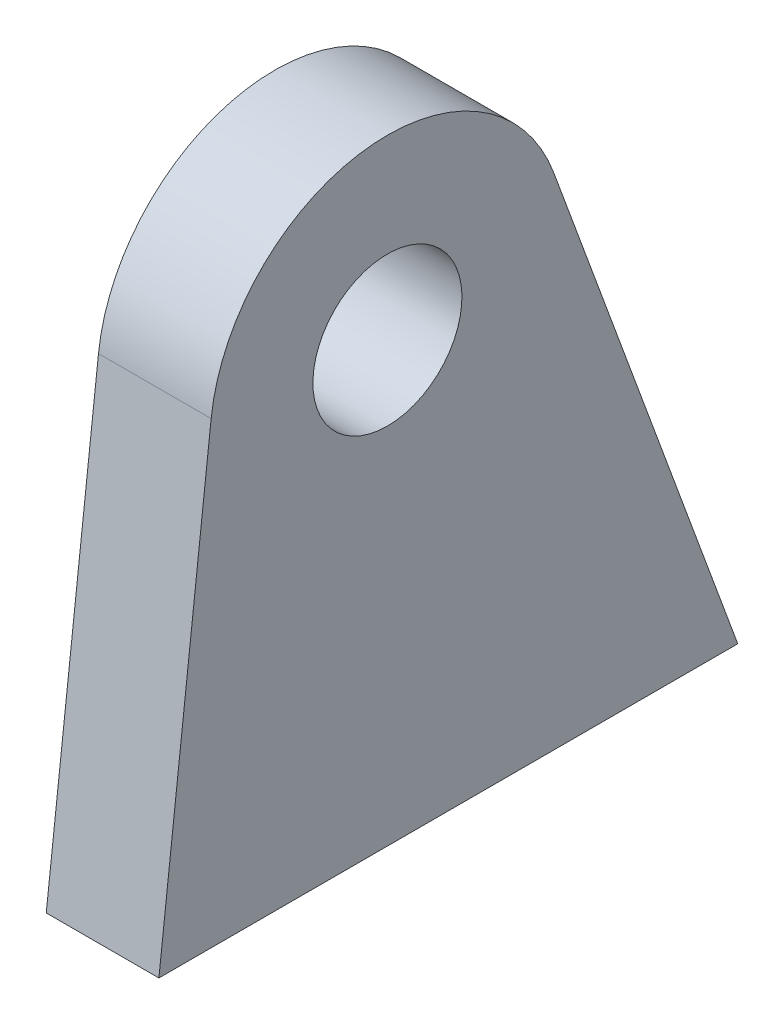
ISO-10303-21;
HEADER;
FILE_DESCRIPTION(('STEP AP214'),'2;1');
FILE_NAME('part.step','',(''),(''),'','','');
FILE_SCHEMA(('AUTOMOTIVE_DESIGN { 1 0 10303 214 1 1 1 1 }'));
ENDSEC;
DATA;
#1=APPLICATION_CONTEXT('core data for automotive mechanical design processes');
#2=APPLICATION_PROTOCOL_DEFINITION('international standard','automotive_design',2000,#1);
#3=PRODUCT_CONTEXT('',#1,'mechanical');
#4=PRODUCT('Part','Part','',(#3));
#5=PRODUCT_RELATED_PRODUCT_CATEGORY('part','',(#4));
#6=PRODUCT_DEFINITION_FORMATION('','',#4);
#7=PRODUCT_DEFINITION_CONTEXT('part definition',#1,'design');
#8=PRODUCT_DEFINITION('design','',#6,#7);
#9=PRODUCT_DEFINITION_SHAPE('','',#8);
#10=(LENGTH_UNIT() NAMED_UNIT(*) SI_UNIT(.MILLI.,.METRE.));
#11=(NAMED_UNIT(*) PLANE_ANGLE_UNIT() SI_UNIT($,.RADIAN.));
#12=(NAMED_UNIT(*) SI_UNIT($,.STERADIAN.) SOLID_ANGLE_UNIT());
#13=UNCERTAINTY_MEASURE_WITH_UNIT(LENGTH_MEASURE(1.E-05),#10,'distance_accuracy_value','');
#14=(GEOMETRIC_REPRESENTATION_CONTEXT(3) GLOBAL_UNCERTAINTY_ASSIGNED_CONTEXT((#13)) GLOBAL_UNIT_ASSIGNED_CONTEXT((#10,
#11,#12)) REPRESENTATION_CONTEXT('',''));
#15=CARTESIAN_POINT('',(0.,0.,0.));
#16=DIRECTION('',(0.,0.,1.));
#17=DIRECTION('',(1.,0.,0.));
#18=AXIS2_PLACEMENT_3D('',#15,#16,#17);
#19=CARTESIAN_POINT('',(-88.05,357.223601629014,-907.3289681282));
#20=DIRECTION('',(-1.,0.,0.));
#21=DIRECTION('',(0.,-1.,0.));
#22=AXIS2_PLACEMENT_3D('',#19,#20,#21);
#23=PLANE('',#22);
#24=DIRECTION('',(0.,0.,1.));
#25=VECTOR('',#24,1.);
#26=CARTESIAN_POINT('',(-88.05,332.523601629014,-927.075106991279));
#27=LINE('',#26,#25);
#28=CARTESIAN_POINT('',(-88.05,332.523601629014,-927.075106991279));
#29=VERTEX_POINT('',#28);
#30=CARTESIAN_POINT('',(-88.05,332.523601629015,-894.448362552374));
#31=VERTEX_POINT('',#30);
#32=EDGE_CURVE('E89',#29,#31,#27,.T.);
#33=ORIENTED_EDGE('',*,*,#32,.T.);
#34=DIRECTION('',(0.,0.993564504843119,-0.113267712592108));
#35=VECTOR('',#34,1.);
#36=CARTESIAN_POINT('',(-88.05,332.523601629015,-894.448362552374));
#37=LINE('',#36,#35);
#38=CARTESIAN_POINT('',(-88.05,358.356278754935,-897.393323079769));
#39=VERTEX_POINT('',#38);
#40=EDGE_CURVE('E84',#31,#39,#37,.T.);
#41=ORIENTED_EDGE('',*,*,#40,.T.);
#42=CARTESIAN_POINT('',(-88.05,357.223601629014,-907.3289681282));
#43=DIRECTION('',(-1.,0.,0.));
#44=DIRECTION('',(0.,-1.,0.));
#45=AXIS2_PLACEMENT_3D('',#42,#43,#44);
#46=CIRCLE('',#45,9.99999999999995);
#47=CARTESIAN_POINT('',(-88.05,360.677443287938,-916.713582014508));
#48=VERTEX_POINT('',#47);
#49=EDGE_CURVE('E87',#39,#48,#46,.T.);
#50=ORIENTED_EDGE('',*,*,#49,.T.);
#51=DIRECTION('',(0.,-0.938461388630789,-0.345384165892374));
#52=VECTOR('',#51,1.);
#53=CARTESIAN_POINT('',(-88.05,360.677443287938,-916.713582014508));
#54=LINE('',#53,#52);
#55=EDGE_CURVE('E54',#48,#29,#54,.T.);
#56=ORIENTED_EDGE('',*,*,#55,.T.);
#57=EDGE_LOOP('',(#33,#41,#50,#56));
#58=FACE_BOUND('',#57,.T.);
#59=CARTESIAN_POINT('',(-88.05,357.223601629014,-907.3289681282));
#60=DIRECTION('',(-1.,0.,0.));
#61=DIRECTION('',(0.,-1.,0.));
#62=AXIS2_PLACEMENT_3D('',#59,#60,#61);
#63=CIRCLE('',#62,4.19999999999998);
#64=CARTESIAN_POINT('',(-88.05,353.023601629014,-907.3289681282));
#65=VERTEX_POINT('',#64);
#66=EDGE_CURVE('E104',#65,#65,#63,.T.);
#67=ORIENTED_EDGE('',*,*,#66,.F.);
#68=EDGE_LOOP('',(#67));
#69=FACE_BOUND('',#68,.T.);
#70=ADVANCED_FACE('F37',(#58,#69),#23,.T.);
#71=CARTESIAN_POINT('',(-81.7,357.223601629014,-907.3289681282));
#72=DIRECTION('',(-1.,0.,0.));
#73=DIRECTION('',(0.,-1.,0.));
#74=AXIS2_PLACEMENT_3D('',#71,#72,#73);
#75=PLANE('',#74);
#76=DIRECTION('',(0.,0.,1.));
#77=VECTOR('',#76,1.);
#78=CARTESIAN_POINT('',(-81.7,332.523601629014,-927.075106991279));
#79=LINE('',#78,#77);
#80=CARTESIAN_POINT('',(-81.7,332.523601629014,-927.075106991279));
#81=VERTEX_POINT('',#80);
#82=CARTESIAN_POINT('',(-81.7,332.523601629015,-894.448362552374));
#83=VERTEX_POINT('',#82);
#84=EDGE_CURVE('E101',#81,#83,#79,.T.);
#85=ORIENTED_EDGE('',*,*,#84,.F.);
#86=DIRECTION('',(0.,-0.938461388630789,-0.345384165892374));
#87=VECTOR('',#86,1.);
#88=CARTESIAN_POINT('',(-81.7,360.677443287938,-916.713582014508));
#89=LINE('',#88,#87);
#90=CARTESIAN_POINT('',(-81.7,360.677443287938,-916.713582014508));
#91=VERTEX_POINT('',#90);
#92=EDGE_CURVE('E77',#91,#81,#89,.T.);
#93=ORIENTED_EDGE('',*,*,#92,.F.);
#94=CARTESIAN_POINT('',(-81.7,357.223601629014,-907.3289681282));
#95=DIRECTION('',(-1.,0.,0.));
#96=DIRECTION('',(0.,-1.,0.));
#97=AXIS2_PLACEMENT_3D('',#94,#95,#96);
#98=CIRCLE('',#97,9.99999999999995);
#99=CARTESIAN_POINT('',(-81.7,358.356278754935,-897.393323079769));
#100=VERTEX_POINT('',#99);
#101=EDGE_CURVE('E71',#100,#91,#98,.T.);
#102=ORIENTED_EDGE('',*,*,#101,.F.);
#103=DIRECTION('',(0.,0.993564504843119,-0.113267712592108));
#104=VECTOR('',#103,1.);
#105=CARTESIAN_POINT('',(-81.7,332.523601629015,-894.448362552374));
#106=LINE('',#105,#104);
#107=EDGE_CURVE('E93',#83,#100,#106,.T.);
#108=ORIENTED_EDGE('',*,*,#107,.F.);
#109=EDGE_LOOP('',(#85,#93,#102,#108));
#110=FACE_BOUND('',#109,.T.);
#111=CARTESIAN_POINT('',(-81.7,357.223601629014,-907.3289681282));
#112=DIRECTION('',(-1.,0.,0.));
#113=DIRECTION('',(0.,-1.,0.));
#114=AXIS2_PLACEMENT_3D('',#111,#112,#113);
#115=CIRCLE('',#114,4.19999999999998);
#116=CARTESIAN_POINT('',(-81.7,353.023601629014,-907.3289681282));
#117=VERTEX_POINT('',#116);
#118=EDGE_CURVE('E116',#117,#117,#115,.T.);
#119=ORIENTED_EDGE('',*,*,#118,.T.);
#120=EDGE_LOOP('',(#119));
#121=FACE_BOUND('',#120,.T.);
#122=ADVANCED_FACE('F112',(#110,#121),#75,.F.);
#123=CARTESIAN_POINT('',(-88.05,332.523601629014,-927.075106991279));
#124=DIRECTION('',(0.,1.,0.));
#125=DIRECTION('',(0.,0.,1.));
#126=AXIS2_PLACEMENT_3D('',#123,#124,#125);
#127=PLANE('',#126);
#128=ORIENTED_EDGE('',*,*,#84,.T.);
#129=DIRECTION('',(1.,0.,0.));
#130=VECTOR('',#129,1.);
#131=CARTESIAN_POINT('',(-88.05,332.523601629015,-894.448362552374));
#132=LINE('',#131,#130);
#133=EDGE_CURVE('E11',#31,#83,#132,.T.);
#134=ORIENTED_EDGE('',*,*,#133,.F.);
#135=ORIENTED_EDGE('',*,*,#32,.F.);
#136=DIRECTION('',(1.,0.,0.));
#137=VECTOR('',#136,1.);
#138=CARTESIAN_POINT('',(-88.05,332.523601629014,-927.075106991279));
#139=LINE('',#138,#137);
#140=EDGE_CURVE('E97',#29,#81,#139,.T.);
#141=ORIENTED_EDGE('',*,*,#140,.T.);
#142=EDGE_LOOP('',(#128,#134,#135,#141));
#143=FACE_BOUND('',#142,.T.);
#144=ADVANCED_FACE('F39',(#143),#127,.F.);
#145=CARTESIAN_POINT('',(-88.05,332.523601629015,-894.448362552374));
#146=DIRECTION('',(0.,-0.113267712592108,-0.993564504843119));
#147=DIRECTION('',(0.,0.993564504843119,-0.113267712592108));
#148=AXIS2_PLACEMENT_3D('',#145,#146,#147);
#149=PLANE('',#148);
#150=ORIENTED_EDGE('',*,*,#107,.T.);
#151=DIRECTION('',(1.,0.,0.));
#152=VECTOR('',#151,1.);
#153=CARTESIAN_POINT('',(-88.05,358.356278754935,-897.393323079769));
#154=LINE('',#153,#152);
#155=EDGE_CURVE('E46',#39,#100,#154,.T.);
#156=ORIENTED_EDGE('',*,*,#155,.F.);
#157=ORIENTED_EDGE('',*,*,#40,.F.);
#158=ORIENTED_EDGE('',*,*,#133,.T.);
#159=EDGE_LOOP('',(#150,#156,#157,#158));
#160=FACE_BOUND('',#159,.T.);
#161=ADVANCED_FACE('F92',(#160),#149,.F.);
#162=CARTESIAN_POINT('',(-88.05,357.223601629014,-907.3289681282));
#163=DIRECTION('',(1.,0.,0.));
#164=DIRECTION('',(0.,1.,0.));
#165=AXIS2_PLACEMENT_3D('',#162,#163,#164);
#166=CYLINDRICAL_SURFACE('',#165,9.99999999999995);
#167=ORIENTED_EDGE('',*,*,#101,.T.);
#168=DIRECTION('',(1.,0.,0.));
#169=VECTOR('',#168,1.);
#170=CARTESIAN_POINT('',(-88.05,360.677443287938,-916.713582014508));
#171=LINE('',#170,#169);
#172=EDGE_CURVE('E94',#48,#91,#171,.T.);
#173=ORIENTED_EDGE('',*,*,#172,.F.);
#174=ORIENTED_EDGE('',*,*,#49,.F.);
#175=ORIENTED_EDGE('',*,*,#155,.T.);
#176=EDGE_LOOP('',(#167,#173,#174,#175));
#177=FACE_BOUND('',#176,.T.);
#178=ADVANCED_FACE('F95',(#177),#166,.T.);
#179=CARTESIAN_POINT('',(-88.05,360.677443287938,-916.713582014508));
#180=DIRECTION('',(0.,-0.345384165892374,0.938461388630789));
#181=DIRECTION('',(0.,-0.938461388630789,-0.345384165892374));
#182=AXIS2_PLACEMENT_3D('',#179,#180,#181);
#183=PLANE('',#182);
#184=ORIENTED_EDGE('',*,*,#92,.T.);
#185=ORIENTED_EDGE('',*,*,#140,.F.);
#186=ORIENTED_EDGE('',*,*,#55,.F.);
#187=ORIENTED_EDGE('',*,*,#172,.T.);
#188=EDGE_LOOP('',(#184,#185,#186,#187));
#189=FACE_BOUND('',#188,.T.);
#190=ADVANCED_FACE('F109',(#189),#183,.F.);
#191=CARTESIAN_POINT('',(-88.05,357.223601629014,-907.3289681282));
#192=DIRECTION('',(1.,0.,0.));
#193=DIRECTION('',(0.,1.,0.));
#194=AXIS2_PLACEMENT_3D('',#191,#192,#193);
#195=CYLINDRICAL_SURFACE('',#194,4.19999999999998);
#196=ORIENTED_EDGE('',*,*,#66,.T.);
#197=EDGE_LOOP('',(#196));
#198=FACE_BOUND('',#197,.T.);
#199=ORIENTED_EDGE('',*,*,#118,.F.);
#200=EDGE_LOOP('',(#199));
#201=FACE_BOUND('',#200,.T.);
#202=ADVANCED_FACE('F122',(#198,#201),#195,.F.);
#203=CLOSED_SHELL('',(#70,#122,#144,#161,#178,#190,#202));
#204=MANIFOLD_SOLID_BREP('B2',#203);
#205=ADVANCED_BREP_SHAPE_REPRESENTATION('',(#18,#204),#14);
#206=SHAPE_DEFINITION_REPRESENTATION(#9,#205);
ENDSEC;
END-ISO-10303-21;
